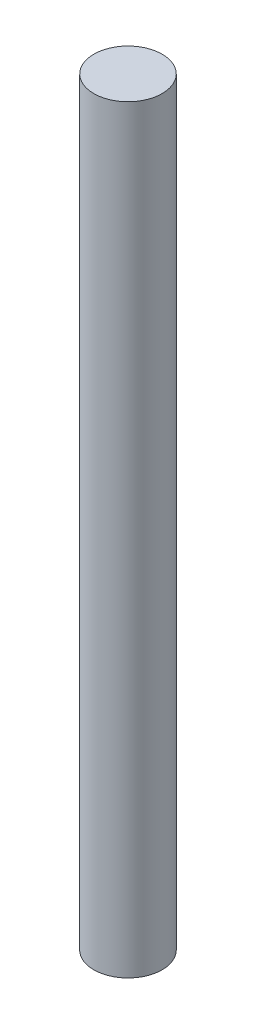
ISO-10303-21;
HEADER;
FILE_DESCRIPTION(('STEP AP214'),'2;1');
FILE_NAME('part.step','',(''),(''),'','','');
FILE_SCHEMA(('AUTOMOTIVE_DESIGN { 1 0 10303 214 1 1 1 1 }'));
ENDSEC;
DATA;
#1=APPLICATION_CONTEXT('core data for automotive mechanical design processes');
#2=APPLICATION_PROTOCOL_DEFINITION('international standard','automotive_design',2000,#1);
#3=PRODUCT_CONTEXT('',#1,'mechanical');
#4=PRODUCT('Part','Part','',(#3));
#5=PRODUCT_RELATED_PRODUCT_CATEGORY('part','',(#4));
#6=PRODUCT_DEFINITION_FORMATION('','',#4);
#7=PRODUCT_DEFINITION_CONTEXT('part definition',#1,'design');
#8=PRODUCT_DEFINITION('design','',#6,#7);
#9=PRODUCT_DEFINITION_SHAPE('','',#8);
#10=(LENGTH_UNIT() NAMED_UNIT(*) SI_UNIT(.MILLI.,.METRE.));
#11=(NAMED_UNIT(*) PLANE_ANGLE_UNIT() SI_UNIT($,.RADIAN.));
#12=(NAMED_UNIT(*) SI_UNIT($,.STERADIAN.) SOLID_ANGLE_UNIT());
#13=UNCERTAINTY_MEASURE_WITH_UNIT(LENGTH_MEASURE(1.E-05),#10,'distance_accuracy_value','');
#14=(GEOMETRIC_REPRESENTATION_CONTEXT(3) GLOBAL_UNCERTAINTY_ASSIGNED_CONTEXT((#13)) GLOBAL_UNIT_ASSIGNED_CONTEXT((#10,
#11,#12)) REPRESENTATION_CONTEXT('',''));
#15=CARTESIAN_POINT('',(0.,0.,0.));
#16=DIRECTION('',(0.,0.,1.));
#17=DIRECTION('',(1.,0.,0.));
#18=AXIS2_PLACEMENT_3D('',#15,#16,#17);
#19=CARTESIAN_POINT('',(0.,0.,0.));
#20=DIRECTION('',(0.,1.,0.));
#21=DIRECTION('',(0.,0.,1.));
#22=AXIS2_PLACEMENT_3D('',#19,#20,#21);
#23=PLANE('',#22);
#24=CARTESIAN_POINT('',(0.,0.,0.));
#25=DIRECTION('',(0.,1.,0.));
#26=DIRECTION('',(0.,0.,1.));
#27=AXIS2_PLACEMENT_3D('',#24,#25,#26);
#28=CIRCLE('',#27,6.75);
#29=CARTESIAN_POINT('',(0.,0.,6.75));
#30=VERTEX_POINT('',#29);
#31=EDGE_CURVE('E37',#30,#30,#28,.T.);
#32=ORIENTED_EDGE('',*,*,#31,.F.);
#33=EDGE_LOOP('',(#32));
#34=FACE_BOUND('',#33,.T.);
#35=ADVANCED_FACE('F30',(#34),#23,.F.);
#36=CARTESIAN_POINT('',(0.,150.,0.));
#37=DIRECTION('',(0.,1.,0.));
#38=DIRECTION('',(0.,0.,1.));
#39=AXIS2_PLACEMENT_3D('',#36,#37,#38);
#40=PLANE('',#39);
#41=CARTESIAN_POINT('',(0.,150.,0.));
#42=DIRECTION('',(0.,1.,0.));
#43=DIRECTION('',(0.,0.,1.));
#44=AXIS2_PLACEMENT_3D('',#41,#42,#43);
#45=CIRCLE('',#44,6.75);
#46=CARTESIAN_POINT('',(0.,150.,6.75));
#47=VERTEX_POINT('',#46);
#48=EDGE_CURVE('E11',#47,#47,#45,.T.);
#49=ORIENTED_EDGE('',*,*,#48,.T.);
#50=EDGE_LOOP('',(#49));
#51=FACE_BOUND('',#50,.T.);
#52=ADVANCED_FACE('F44',(#51),#40,.T.);
#53=CARTESIAN_POINT('',(0.,0.,0.));
#54=DIRECTION('',(0.,1.,0.));
#55=DIRECTION('',(0.,0.,1.));
#56=AXIS2_PLACEMENT_3D('',#53,#54,#55);
#57=CYLINDRICAL_SURFACE('',#56,6.75);
#58=ORIENTED_EDGE('',*,*,#48,.F.);
#59=EDGE_LOOP('',(#58));
#60=FACE_BOUND('',#59,.T.);
#61=ORIENTED_EDGE('',*,*,#31,.T.);
#62=EDGE_LOOP('',(#61));
#63=FACE_BOUND('',#62,.T.);
#64=ADVANCED_FACE('F46',(#60,#63),#57,.T.);
#65=CLOSED_SHELL('',(#35,#52,#64));
#66=MANIFOLD_SOLID_BREP('B2',#65);
#67=ADVANCED_BREP_SHAPE_REPRESENTATION('',(#18,#66),#14);
#68=SHAPE_DEFINITION_REPRESENTATION(#9,#67);
ENDSEC;
END-ISO-10303-21;
